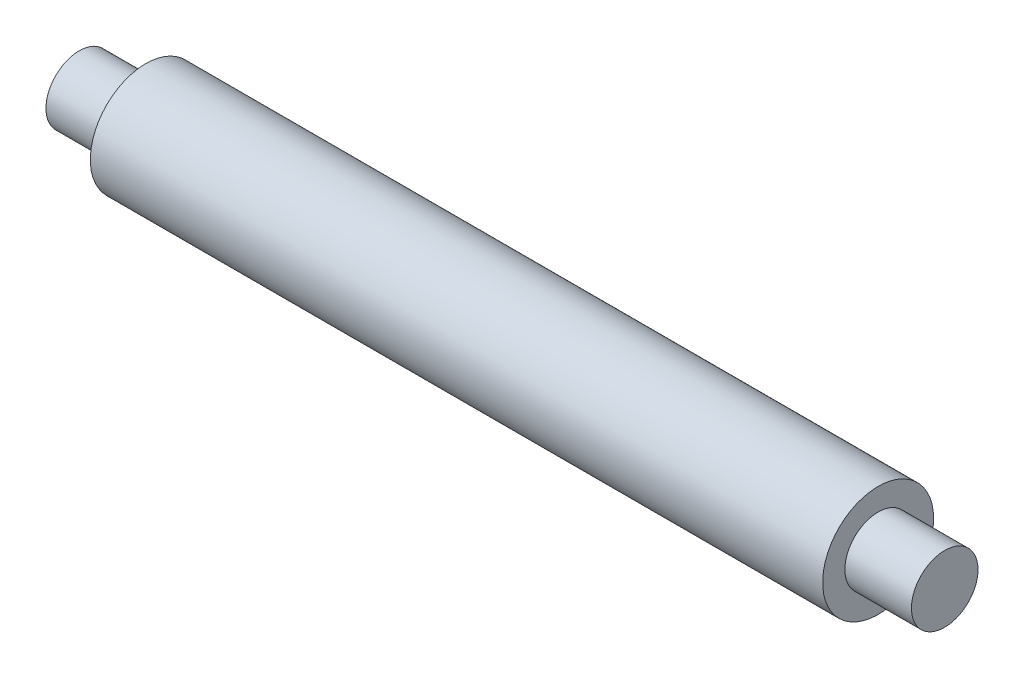
ISO-10303-21;
HEADER;
FILE_DESCRIPTION(('STEP AP214'),'2;1');
FILE_NAME('part.step','',(''),(''),'','','');
FILE_SCHEMA(('AUTOMOTIVE_DESIGN { 1 0 10303 214 1 1 1 1 }'));
ENDSEC;
DATA;
#1=APPLICATION_CONTEXT('core data for automotive mechanical design processes');
#2=APPLICATION_PROTOCOL_DEFINITION('international standard','automotive_design',2000,#1);
#3=PRODUCT_CONTEXT('',#1,'mechanical');
#4=PRODUCT('Part','Part','',(#3));
#5=PRODUCT_RELATED_PRODUCT_CATEGORY('part','',(#4));
#6=PRODUCT_DEFINITION_FORMATION('','',#4);
#7=PRODUCT_DEFINITION_CONTEXT('part definition',#1,'design');
#8=PRODUCT_DEFINITION('design','',#6,#7);
#9=PRODUCT_DEFINITION_SHAPE('','',#8);
#10=(LENGTH_UNIT() NAMED_UNIT(*) SI_UNIT(.MILLI.,.METRE.));
#11=(NAMED_UNIT(*) PLANE_ANGLE_UNIT() SI_UNIT($,.RADIAN.));
#12=(NAMED_UNIT(*) SI_UNIT($,.STERADIAN.) SOLID_ANGLE_UNIT());
#13=UNCERTAINTY_MEASURE_WITH_UNIT(LENGTH_MEASURE(1.E-05),#10,'distance_accuracy_value','');
#14=(GEOMETRIC_REPRESENTATION_CONTEXT(3) GLOBAL_UNCERTAINTY_ASSIGNED_CONTEXT((#13)) GLOBAL_UNIT_ASSIGNED_CONTEXT((#10,
#11,#12)) REPRESENTATION_CONTEXT('',''));
#15=CARTESIAN_POINT('',(0.,0.,0.));
#16=DIRECTION('',(0.,0.,1.));
#17=DIRECTION('',(1.,0.,0.));
#18=AXIS2_PLACEMENT_3D('',#15,#16,#17);
#19=CARTESIAN_POINT('',(-19.5,0.,0.));
#20=DIRECTION('',(-1.,0.,0.));
#21=DIRECTION('',(0.,0.,1.));
#22=AXIS2_PLACEMENT_3D('',#19,#20,#21);
#23=PLANE('',#22);
#24=CARTESIAN_POINT('',(-19.5,0.,0.));
#25=DIRECTION('',(1.,0.,0.));
#26=DIRECTION('',(0.,0.,-1.));
#27=AXIS2_PLACEMENT_3D('',#24,#25,#26);
#28=CIRCLE('',#27,1.5);
#29=CARTESIAN_POINT('',(-19.5,0.,-1.5));
#30=VERTEX_POINT('',#29);
#31=EDGE_CURVE('E10',#30,#30,#28,.T.);
#32=ORIENTED_EDGE('',*,*,#31,.F.);
#33=EDGE_LOOP('',(#32));
#34=FACE_BOUND('',#33,.T.);
#35=ADVANCED_FACE('F35',(#34),#23,.T.);
#36=CARTESIAN_POINT('',(19.5,0.,0.));
#37=DIRECTION('',(1.,0.,0.));
#38=DIRECTION('',(0.,0.,-1.));
#39=AXIS2_PLACEMENT_3D('',#36,#37,#38);
#40=CYLINDRICAL_SURFACE('',#39,1.5);
#41=ORIENTED_EDGE('',*,*,#31,.T.);
#42=EDGE_LOOP('',(#41));
#43=FACE_BOUND('',#42,.T.);
#44=CARTESIAN_POINT('',(-16.5,0.,0.));
#45=DIRECTION('',(1.,0.,0.));
#46=DIRECTION('',(0.,0.,-1.));
#47=AXIS2_PLACEMENT_3D('',#44,#45,#46);
#48=CIRCLE('',#47,1.5);
#49=CARTESIAN_POINT('',(-16.5,0.,-1.5));
#50=VERTEX_POINT('',#49);
#51=EDGE_CURVE('E41',#50,#50,#48,.T.);
#52=ORIENTED_EDGE('',*,*,#51,.F.);
#53=EDGE_LOOP('',(#52));
#54=FACE_BOUND('',#53,.T.);
#55=ADVANCED_FACE('F77',(#43,#54),#40,.T.);
#56=CARTESIAN_POINT('',(-16.5,1.5,0.));
#57=DIRECTION('',(-1.,0.,0.));
#58=DIRECTION('',(0.,0.,1.));
#59=AXIS2_PLACEMENT_3D('',#56,#57,#58);
#60=PLANE('',#59);
#61=ORIENTED_EDGE('',*,*,#51,.T.);
#62=EDGE_LOOP('',(#61));
#63=FACE_BOUND('',#62,.T.);
#64=CARTESIAN_POINT('',(-16.5,0.,0.));
#65=DIRECTION('',(1.,0.,0.));
#66=DIRECTION('',(0.,0.,-1.));
#67=AXIS2_PLACEMENT_3D('',#64,#65,#66);
#68=CIRCLE('',#67,2.5);
#69=CARTESIAN_POINT('',(-16.5,0.,-2.5));
#70=VERTEX_POINT('',#69);
#71=EDGE_CURVE('E45',#70,#70,#68,.T.);
#72=ORIENTED_EDGE('',*,*,#71,.F.);
#73=EDGE_LOOP('',(#72));
#74=FACE_BOUND('',#73,.T.);
#75=ADVANCED_FACE('F82',(#63,#74),#60,.T.);
#76=CARTESIAN_POINT('',(19.5,0.,0.));
#77=DIRECTION('',(1.,0.,0.));
#78=DIRECTION('',(0.,0.,-1.));
#79=AXIS2_PLACEMENT_3D('',#76,#77,#78);
#80=CYLINDRICAL_SURFACE('',#79,2.5);
#81=ORIENTED_EDGE('',*,*,#71,.T.);
#82=EDGE_LOOP('',(#81));
#83=FACE_BOUND('',#82,.T.);
#84=CARTESIAN_POINT('',(16.5,0.,0.));
#85=DIRECTION('',(1.,0.,0.));
#86=DIRECTION('',(0.,0.,-1.));
#87=AXIS2_PLACEMENT_3D('',#84,#85,#86);
#88=CIRCLE('',#87,2.5);
#89=CARTESIAN_POINT('',(16.5,0.,-2.5));
#90=VERTEX_POINT('',#89);
#91=EDGE_CURVE('E49',#90,#90,#88,.T.);
#92=ORIENTED_EDGE('',*,*,#91,.F.);
#93=EDGE_LOOP('',(#92));
#94=FACE_BOUND('',#93,.T.);
#95=ADVANCED_FACE('F73',(#83,#94),#80,.T.);
#96=CARTESIAN_POINT('',(16.5,2.5,0.));
#97=DIRECTION('',(1.,0.,0.));
#98=DIRECTION('',(0.,0.,-1.));
#99=AXIS2_PLACEMENT_3D('',#96,#97,#98);
#100=PLANE('',#99);
#101=ORIENTED_EDGE('',*,*,#91,.T.);
#102=EDGE_LOOP('',(#101));
#103=FACE_BOUND('',#102,.T.);
#104=CARTESIAN_POINT('',(16.5,0.,0.));
#105=DIRECTION('',(1.,0.,0.));
#106=DIRECTION('',(0.,0.,-1.));
#107=AXIS2_PLACEMENT_3D('',#104,#105,#106);
#108=CIRCLE('',#107,1.5);
#109=CARTESIAN_POINT('',(16.5,0.,-1.5));
#110=VERTEX_POINT('',#109);
#111=EDGE_CURVE('E54',#110,#110,#108,.T.);
#112=ORIENTED_EDGE('',*,*,#111,.F.);
#113=EDGE_LOOP('',(#112));
#114=FACE_BOUND('',#113,.T.);
#115=ADVANCED_FACE('F65',(#103,#114),#100,.T.);
#116=CARTESIAN_POINT('',(19.5,0.,0.));
#117=DIRECTION('',(1.,0.,0.));
#118=DIRECTION('',(0.,0.,-1.));
#119=AXIS2_PLACEMENT_3D('',#116,#117,#118);
#120=CYLINDRICAL_SURFACE('',#119,1.5);
#121=ORIENTED_EDGE('',*,*,#111,.T.);
#122=EDGE_LOOP('',(#121));
#123=FACE_BOUND('',#122,.T.);
#124=CARTESIAN_POINT('',(19.5,0.,0.));
#125=DIRECTION('',(1.,0.,0.));
#126=DIRECTION('',(0.,0.,-1.));
#127=AXIS2_PLACEMENT_3D('',#124,#125,#126);
#128=CIRCLE('',#127,1.5);
#129=CARTESIAN_POINT('',(19.5,0.,-1.5));
#130=VERTEX_POINT('',#129);
#131=EDGE_CURVE('E57',#130,#130,#128,.T.);
#132=ORIENTED_EDGE('',*,*,#131,.F.);
#133=EDGE_LOOP('',(#132));
#134=FACE_BOUND('',#133,.T.);
#135=ADVANCED_FACE('F63',(#123,#134),#120,.T.);
#136=CARTESIAN_POINT('',(19.5,1.5,0.));
#137=DIRECTION('',(1.,0.,0.));
#138=DIRECTION('',(0.,0.,-1.));
#139=AXIS2_PLACEMENT_3D('',#136,#137,#138);
#140=PLANE('',#139);
#141=ORIENTED_EDGE('',*,*,#131,.T.);
#142=EDGE_LOOP('',(#141));
#143=FACE_BOUND('',#142,.T.);
#144=ADVANCED_FACE('F61',(#143),#140,.T.);
#145=CLOSED_SHELL('',(#35,#55,#75,#95,#115,#135,#144));
#146=MANIFOLD_SOLID_BREP('B2',#145);
#147=ADVANCED_BREP_SHAPE_REPRESENTATION('',(#18,#146),#14);
#148=SHAPE_DEFINITION_REPRESENTATION(#9,#147);
ENDSEC;
END-ISO-10303-21;
